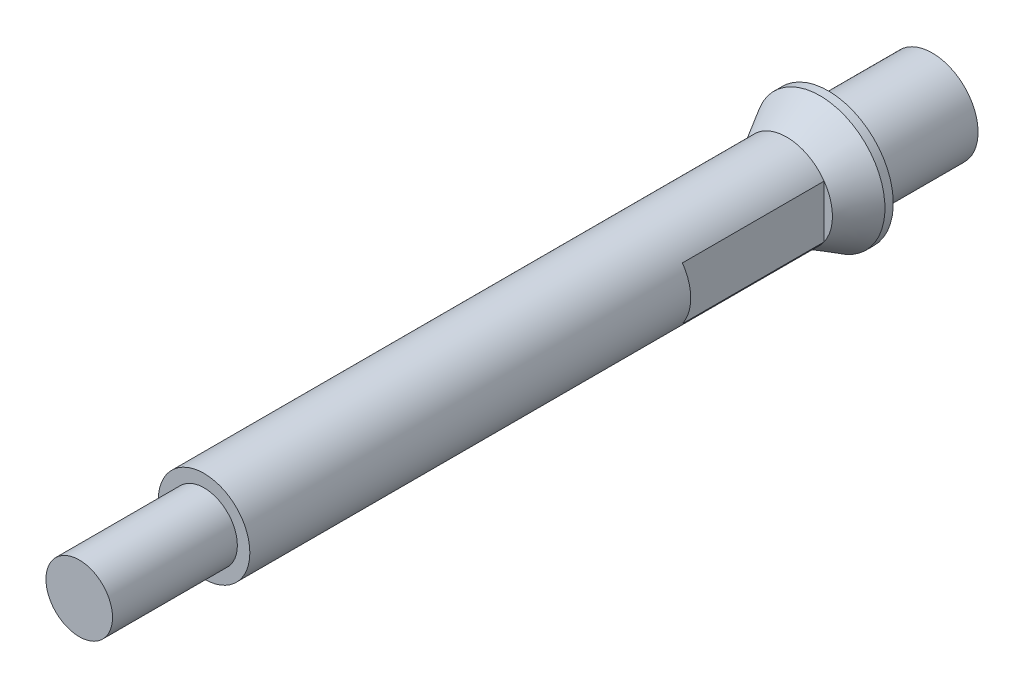
ISO-10303-21;
HEADER;
FILE_DESCRIPTION(('STEP AP214'),'2;1');
FILE_NAME('part.step','',(''),(''),'','','');
FILE_SCHEMA(('AUTOMOTIVE_DESIGN { 1 0 10303 214 1 1 1 1 }'));
ENDSEC;
DATA;
#1=APPLICATION_CONTEXT('core data for automotive mechanical design processes');
#2=APPLICATION_PROTOCOL_DEFINITION('international standard','automotive_design',2000,#1);
#3=PRODUCT_CONTEXT('',#1,'mechanical');
#4=PRODUCT('Part','Part','',(#3));
#5=PRODUCT_RELATED_PRODUCT_CATEGORY('part','',(#4));
#6=PRODUCT_DEFINITION_FORMATION('','',#4);
#7=PRODUCT_DEFINITION_CONTEXT('part definition',#1,'design');
#8=PRODUCT_DEFINITION('design','',#6,#7);
#9=PRODUCT_DEFINITION_SHAPE('','',#8);
#10=(LENGTH_UNIT() NAMED_UNIT(*) SI_UNIT(.MILLI.,.METRE.));
#11=(NAMED_UNIT(*) PLANE_ANGLE_UNIT() SI_UNIT($,.RADIAN.));
#12=(NAMED_UNIT(*) SI_UNIT($,.STERADIAN.) SOLID_ANGLE_UNIT());
#13=UNCERTAINTY_MEASURE_WITH_UNIT(LENGTH_MEASURE(1.E-05),#10,'distance_accuracy_value','');
#14=(GEOMETRIC_REPRESENTATION_CONTEXT(3) GLOBAL_UNCERTAINTY_ASSIGNED_CONTEXT((#13)) GLOBAL_UNIT_ASSIGNED_CONTEXT((#10,
#11,#12)) REPRESENTATION_CONTEXT('',''));
#15=CARTESIAN_POINT('',(0.,0.,0.));
#16=DIRECTION('',(0.,0.,1.));
#17=DIRECTION('',(1.,0.,0.));
#18=AXIS2_PLACEMENT_3D('',#15,#16,#17);
#19=CARTESIAN_POINT('',(0.,0.,-9.99999999999999));
#20=DIRECTION('',(0.,0.,-1.));
#21=DIRECTION('',(-1.,0.,0.));
#22=AXIS2_PLACEMENT_3D('',#19,#20,#21);
#23=PLANE('',#22);
#24=CARTESIAN_POINT('',(0.,0.,-9.99999999999999));
#25=DIRECTION('',(0.,0.,-1.));
#26=DIRECTION('',(-1.,0.,0.));
#27=AXIS2_PLACEMENT_3D('',#24,#25,#26);
#28=CIRCLE('',#27,15.618802153517);
#29=CARTESIAN_POINT('',(-15.618802153517,0.,-9.99999999999999));
#30=VERTEX_POINT('',#29);
#31=EDGE_CURVE('E103',#30,#30,#28,.T.);
#32=ORIENTED_EDGE('',*,*,#31,.T.);
#33=EDGE_LOOP('',(#32));
#34=FACE_BOUND('',#33,.T.);
#35=CARTESIAN_POINT('',(0.,0.,-9.99999999999999));
#36=DIRECTION('',(0.,0.,-1.));
#37=DIRECTION('',(-1.,0.,0.));
#38=AXIS2_PLACEMENT_3D('',#35,#36,#37);
#39=CIRCLE('',#38,11.);
#40=CARTESIAN_POINT('',(-11.,0.,-9.99999999999999));
#41=VERTEX_POINT('',#40);
#42=EDGE_CURVE('E130',#41,#41,#39,.T.);
#43=ORIENTED_EDGE('',*,*,#42,.F.);
#44=EDGE_LOOP('',(#43));
#45=FACE_BOUND('',#44,.T.);
#46=ADVANCED_FACE('F34',(#34,#45),#23,.T.);
#47=CARTESIAN_POINT('',(0.,0.,140.));
#48=DIRECTION('',(0.,0.,-1.));
#49=DIRECTION('',(-1.,0.,0.));
#50=AXIS2_PLACEMENT_3D('',#47,#48,#49);
#51=CYLINDRICAL_SURFACE('',#50,11.);
#52=CARTESIAN_POINT('',(0.,0.,140.));
#53=DIRECTION('',(0.,0.,1.));
#54=DIRECTION('',(1.,0.,0.));
#55=AXIS2_PLACEMENT_3D('',#52,#53,#54);
#56=CIRCLE('',#55,11.);
#57=CARTESIAN_POINT('',(11.,0.,140.));
#58=VERTEX_POINT('',#57);
#59=EDGE_CURVE('E111',#58,#58,#56,.T.);
#60=ORIENTED_EDGE('',*,*,#59,.F.);
#61=EDGE_LOOP('',(#60));
#62=FACE_BOUND('',#61,.T.);
#63=CARTESIAN_POINT('',(0.,0.,34.0532161369936));
#64=DIRECTION('',(0.,0.,-1.));
#65=DIRECTION('',(-1.,0.,0.));
#66=AXIS2_PLACEMENT_3D('',#63,#64,#65);
#67=CIRCLE('',#66,11.);
#68=CARTESIAN_POINT('',(8.99999999999991,6.32455532033666,34.0532161369936));
#69=VERTEX_POINT('',#68);
#70=CARTESIAN_POINT('',(8.99999999999995,-6.32455532033685,34.0532161369936));
#71=VERTEX_POINT('',#70);
#72=EDGE_CURVE('E11',#69,#71,#67,.T.);
#73=ORIENTED_EDGE('',*,*,#72,.F.);
#74=DIRECTION('',(0.,0.,-1.));
#75=VECTOR('',#74,1.);
#76=CARTESIAN_POINT('',(8.99999999999991,6.32455532033666,140.));
#77=LINE('',#76,#75);
#78=CARTESIAN_POINT('',(8.99999999999991,6.32455532033666,0.));
#79=VERTEX_POINT('',#78);
#80=EDGE_CURVE('E84',#79,#69,#77,.F.);
#81=ORIENTED_EDGE('',*,*,#80,.F.);
#82=CARTESIAN_POINT('',(0.,0.,0.));
#83=DIRECTION('',(0.,0.,-1.));
#84=DIRECTION('',(-1.,0.,0.));
#85=AXIS2_PLACEMENT_3D('',#82,#83,#84);
#86=CIRCLE('',#85,11.);
#87=CARTESIAN_POINT('',(-9.00000000000006,6.32455532033668,0.));
#88=VERTEX_POINT('',#87);
#89=EDGE_CURVE('E76',#88,#79,#86,.T.);
#90=ORIENTED_EDGE('',*,*,#89,.F.);
#91=DIRECTION('',(0.,0.,-1.));
#92=VECTOR('',#91,1.);
#93=CARTESIAN_POINT('',(-9.00000000000006,6.32455532033668,140.));
#94=LINE('',#93,#92);
#95=CARTESIAN_POINT('',(-9.00000000000006,6.32455532033668,34.0532161369936));
#96=VERTEX_POINT('',#95);
#97=EDGE_CURVE('E117',#96,#88,#94,.T.);
#98=ORIENTED_EDGE('',*,*,#97,.F.);
#99=CARTESIAN_POINT('',(0.,0.,34.0532161369936));
#100=DIRECTION('',(0.,0.,1.));
#101=DIRECTION('',(1.,0.,0.));
#102=AXIS2_PLACEMENT_3D('',#99,#100,#101);
#103=CIRCLE('',#102,11.);
#104=CARTESIAN_POINT('',(-9.00000000000005,-6.32455532033691,34.0532161369936));
#105=VERTEX_POINT('',#104);
#106=EDGE_CURVE('E42',#96,#105,#103,.T.);
#107=ORIENTED_EDGE('',*,*,#106,.T.);
#108=DIRECTION('',(0.,0.,-1.));
#109=VECTOR('',#108,1.);
#110=CARTESIAN_POINT('',(-9.00000000000005,-6.32455532033688,140.));
#111=LINE('',#110,#109);
#112=CARTESIAN_POINT('',(-9.00000000000005,-6.32455532033688,0.));
#113=VERTEX_POINT('',#112);
#114=EDGE_CURVE('E116',#113,#105,#111,.F.);
#115=ORIENTED_EDGE('',*,*,#114,.F.);
#116=CARTESIAN_POINT('',(8.99999999999995,-6.32455532033685,0.));
#117=VERTEX_POINT('',#116);
#118=EDGE_CURVE('E77',#117,#113,#86,.T.);
#119=ORIENTED_EDGE('',*,*,#118,.F.);
#120=DIRECTION('',(0.,0.,-1.));
#121=VECTOR('',#120,1.);
#122=CARTESIAN_POINT('',(8.99999999999995,-6.32455532033685,140.));
#123=LINE('',#122,#121);
#124=EDGE_CURVE('E87',#71,#117,#123,.T.);
#125=ORIENTED_EDGE('',*,*,#124,.F.);
#126=EDGE_LOOP('',(#73,#81,#90,#98,#107,#115,#119,#125));
#127=FACE_BOUND('',#126,.T.);
#128=ADVANCED_FACE('F36',(#62,#127),#51,.T.);
#129=CARTESIAN_POINT('',(0.,0.,140.));
#130=DIRECTION('',(0.,0.,1.));
#131=DIRECTION('',(1.,0.,0.));
#132=AXIS2_PLACEMENT_3D('',#129,#130,#131);
#133=PLANE('',#132);
#134=ORIENTED_EDGE('',*,*,#59,.T.);
#135=EDGE_LOOP('',(#134));
#136=FACE_BOUND('',#135,.T.);
#137=CARTESIAN_POINT('',(0.,0.,140.));
#138=DIRECTION('',(0.,0.,1.));
#139=DIRECTION('',(1.,0.,0.));
#140=AXIS2_PLACEMENT_3D('',#137,#138,#139);
#141=CIRCLE('',#140,8.);
#142=CARTESIAN_POINT('',(8.00000000000001,0.,140.));
#143=VERTEX_POINT('',#142);
#144=EDGE_CURVE('E107',#143,#143,#141,.T.);
#145=ORIENTED_EDGE('',*,*,#144,.F.);
#146=EDGE_LOOP('',(#145));
#147=FACE_BOUND('',#146,.T.);
#148=ADVANCED_FACE('F150',(#136,#147),#133,.T.);
#149=CARTESIAN_POINT('',(0.,0.,170.));
#150=DIRECTION('',(0.,0.,-1.));
#151=DIRECTION('',(-1.,0.,0.));
#152=AXIS2_PLACEMENT_3D('',#149,#150,#151);
#153=CYLINDRICAL_SURFACE('',#152,8.);
#154=CARTESIAN_POINT('',(0.,0.,170.));
#155=DIRECTION('',(0.,0.,1.));
#156=DIRECTION('',(1.,0.,0.));
#157=AXIS2_PLACEMENT_3D('',#154,#155,#156);
#158=CIRCLE('',#157,8.);
#159=CARTESIAN_POINT('',(8.00000000000001,0.,170.));
#160=VERTEX_POINT('',#159);
#161=EDGE_CURVE('E108',#160,#160,#158,.T.);
#162=ORIENTED_EDGE('',*,*,#161,.F.);
#163=EDGE_LOOP('',(#162));
#164=FACE_BOUND('',#163,.T.);
#165=ORIENTED_EDGE('',*,*,#144,.T.);
#166=EDGE_LOOP('',(#165));
#167=FACE_BOUND('',#166,.T.);
#168=ADVANCED_FACE('F167',(#164,#167),#153,.T.);
#169=CARTESIAN_POINT('',(0.,0.,170.));
#170=DIRECTION('',(0.,0.,1.));
#171=DIRECTION('',(1.,0.,0.));
#172=AXIS2_PLACEMENT_3D('',#169,#170,#171);
#173=PLANE('',#172);
#174=ORIENTED_EDGE('',*,*,#161,.T.);
#175=EDGE_LOOP('',(#174));
#176=FACE_BOUND('',#175,.T.);
#177=ADVANCED_FACE('F163',(#176),#173,.T.);
#178=CARTESIAN_POINT('',(0.,0.,0.));
#179=DIRECTION('',(0.,0.,-1.));
#180=DIRECTION('',(-1.,0.,0.));
#181=AXIS2_PLACEMENT_3D('',#178,#179,#180);
#182=CONICAL_SURFACE('',#181,11.,0.5235987755983);
#183=CARTESIAN_POINT('',(0.,0.,-8.));
#184=DIRECTION('',(0.,0.,-1.));
#185=DIRECTION('',(-1.,0.,0.));
#186=AXIS2_PLACEMENT_3D('',#183,#184,#185);
#187=CIRCLE('',#186,15.618802153517);
#188=CARTESIAN_POINT('',(-15.618802153517,0.,-8.));
#189=VERTEX_POINT('',#188);
#190=EDGE_CURVE('E100',#189,#189,#187,.T.);
#191=ORIENTED_EDGE('',*,*,#190,.F.);
#192=EDGE_LOOP('',(#191));
#193=FACE_BOUND('',#192,.T.);
#194=EDGE_CURVE('E99',#113,#88,#86,.T.);
#195=ORIENTED_EDGE('',*,*,#194,.T.);
#196=ORIENTED_EDGE('',*,*,#89,.T.);
#197=EDGE_CURVE('E49',#79,#117,#86,.T.);
#198=ORIENTED_EDGE('',*,*,#197,.T.);
#199=ORIENTED_EDGE('',*,*,#118,.T.);
#200=EDGE_LOOP('',(#195,#196,#198,#199));
#201=FACE_BOUND('',#200,.T.);
#202=ADVANCED_FACE('F97',(#193,#201),#182,.T.);
#203=CARTESIAN_POINT('',(0.,0.,-9.99999999999999));
#204=DIRECTION('',(0.,0.,1.));
#205=DIRECTION('',(1.,0.,0.));
#206=AXIS2_PLACEMENT_3D('',#203,#204,#205);
#207=CYLINDRICAL_SURFACE('',#206,15.618802153517);
#208=ORIENTED_EDGE('',*,*,#31,.F.);
#209=EDGE_LOOP('',(#208));
#210=FACE_BOUND('',#209,.T.);
#211=ORIENTED_EDGE('',*,*,#190,.T.);
#212=EDGE_LOOP('',(#211));
#213=FACE_BOUND('',#212,.T.);
#214=ADVANCED_FACE('F156',(#210,#213),#207,.T.);
#215=CARTESIAN_POINT('',(-9.00000000000006,7.49999999999987,34.0532161369936));
#216=DIRECTION('',(0.,0.,1.));
#217=DIRECTION('',(1.,0.,0.));
#218=AXIS2_PLACEMENT_3D('',#215,#216,#217);
#219=PLANE('',#218);
#220=DIRECTION('',(0.,1.,0.));
#221=VECTOR('',#220,1.);
#222=CARTESIAN_POINT('',(-9.00000000000006,7.49999999999987,34.0532161369936));
#223=LINE('',#222,#221);
#224=EDGE_CURVE('E122',#105,#96,#223,.T.);
#225=ORIENTED_EDGE('',*,*,#224,.F.);
#226=ORIENTED_EDGE('',*,*,#106,.F.);
#227=EDGE_LOOP('',(#225,#226));
#228=FACE_BOUND('',#227,.T.);
#229=ADVANCED_FACE('F159',(#228),#219,.F.);
#230=CARTESIAN_POINT('',(-9.00000000000006,7.49999999999987,0.));
#231=DIRECTION('',(0.,0.,-1.));
#232=DIRECTION('',(-1.,0.,0.));
#233=AXIS2_PLACEMENT_3D('',#230,#231,#232);
#234=PLANE('',#233);
#235=ORIENTED_EDGE('',*,*,#194,.F.);
#236=DIRECTION('',(0.,-1.,0.));
#237=VECTOR('',#236,1.);
#238=CARTESIAN_POINT('',(-9.00000000000006,7.49999999999987,0.));
#239=LINE('',#238,#237);
#240=EDGE_CURVE('E126',#88,#113,#239,.T.);
#241=ORIENTED_EDGE('',*,*,#240,.F.);
#242=EDGE_LOOP('',(#235,#241));
#243=FACE_BOUND('',#242,.T.);
#244=ADVANCED_FACE('F154',(#243),#234,.F.);
#245=CARTESIAN_POINT('',(-9.00000000000005,-7.50000000000006,0.));
#246=DIRECTION('',(-1.,0.,0.));
#247=DIRECTION('',(0.,0.,1.));
#248=AXIS2_PLACEMENT_3D('',#245,#246,#247);
#249=PLANE('',#248);
#250=ORIENTED_EDGE('',*,*,#97,.T.);
#251=ORIENTED_EDGE('',*,*,#240,.T.);
#252=ORIENTED_EDGE('',*,*,#114,.T.);
#253=ORIENTED_EDGE('',*,*,#224,.T.);
#254=EDGE_LOOP('',(#250,#251,#252,#253));
#255=FACE_BOUND('',#254,.T.);
#256=ADVANCED_FACE('F208',(#255),#249,.T.);
#257=CARTESIAN_POINT('',(9.00000000000001,7.50000000000001,34.0532161369936));
#258=DIRECTION('',(0.,0.,-1.));
#259=DIRECTION('',(-1.,0.,0.));
#260=AXIS2_PLACEMENT_3D('',#257,#258,#259);
#261=PLANE('',#260);
#262=DIRECTION('',(0.,1.,0.));
#263=VECTOR('',#262,1.);
#264=CARTESIAN_POINT('',(9.00000000000001,7.50000000000001,34.0532161369936));
#265=LINE('',#264,#263);
#266=EDGE_CURVE('E89',#71,#69,#265,.T.);
#267=ORIENTED_EDGE('',*,*,#266,.T.);
#268=ORIENTED_EDGE('',*,*,#72,.T.);
#269=EDGE_LOOP('',(#267,#268));
#270=FACE_BOUND('',#269,.T.);
#271=ADVANCED_FACE('F215',(#270),#261,.T.);
#272=CARTESIAN_POINT('',(9.00000000000001,7.50000000000001,0.));
#273=DIRECTION('',(0.,0.,1.));
#274=DIRECTION('',(1.,0.,0.));
#275=AXIS2_PLACEMENT_3D('',#272,#273,#274);
#276=PLANE('',#275);
#277=ORIENTED_EDGE('',*,*,#197,.F.);
#278=DIRECTION('',(0.,-1.,0.));
#279=VECTOR('',#278,1.);
#280=CARTESIAN_POINT('',(9.00000000000001,7.50000000000001,0.));
#281=LINE('',#280,#279);
#282=EDGE_CURVE('E74',#79,#117,#281,.T.);
#283=ORIENTED_EDGE('',*,*,#282,.T.);
#284=EDGE_LOOP('',(#277,#283));
#285=FACE_BOUND('',#284,.T.);
#286=ADVANCED_FACE('F73',(#285),#276,.T.);
#287=CARTESIAN_POINT('',(8.99999999999997,-7.50000000000009,0.));
#288=DIRECTION('',(1.,0.,0.));
#289=DIRECTION('',(0.,0.,1.));
#290=AXIS2_PLACEMENT_3D('',#287,#288,#289);
#291=PLANE('',#290);
#292=ORIENTED_EDGE('',*,*,#124,.T.);
#293=ORIENTED_EDGE('',*,*,#282,.F.);
#294=ORIENTED_EDGE('',*,*,#80,.T.);
#295=ORIENTED_EDGE('',*,*,#266,.F.);
#296=EDGE_LOOP('',(#292,#293,#294,#295));
#297=FACE_BOUND('',#296,.T.);
#298=ADVANCED_FACE('F82',(#297),#291,.T.);
#299=CARTESIAN_POINT('',(0.,0.,-35.));
#300=DIRECTION('',(0.,0.,1.));
#301=DIRECTION('',(1.,0.,0.));
#302=AXIS2_PLACEMENT_3D('',#299,#300,#301);
#303=CYLINDRICAL_SURFACE('',#302,11.);
#304=CARTESIAN_POINT('',(0.,0.,-35.));
#305=DIRECTION('',(0.,0.,-1.));
#306=DIRECTION('',(-1.,0.,0.));
#307=AXIS2_PLACEMENT_3D('',#304,#305,#306);
#308=CIRCLE('',#307,11.);
#309=CARTESIAN_POINT('',(-11.,0.,-35.));
#310=VERTEX_POINT('',#309);
#311=EDGE_CURVE('E90',#310,#310,#308,.T.);
#312=ORIENTED_EDGE('',*,*,#311,.F.);
#313=EDGE_LOOP('',(#312));
#314=FACE_BOUND('',#313,.T.);
#315=ORIENTED_EDGE('',*,*,#42,.T.);
#316=EDGE_LOOP('',(#315));
#317=FACE_BOUND('',#316,.T.);
#318=ADVANCED_FACE('F138',(#314,#317),#303,.T.);
#319=CARTESIAN_POINT('',(0.,0.,-35.));
#320=DIRECTION('',(0.,0.,-1.));
#321=DIRECTION('',(-1.,0.,0.));
#322=AXIS2_PLACEMENT_3D('',#319,#320,#321);
#323=PLANE('',#322);
#324=ORIENTED_EDGE('',*,*,#311,.T.);
#325=EDGE_LOOP('',(#324));
#326=FACE_BOUND('',#325,.T.);
#327=ADVANCED_FACE('F136',(#326),#323,.T.);
#328=CLOSED_SHELL('',(#46,#128,#148,#168,#177,#202,#214,#229,#244,#256,#271,#286,#298,#318,#327));
#329=MANIFOLD_SOLID_BREP('B2',#328);
#330=ADVANCED_BREP_SHAPE_REPRESENTATION('',(#18,#329),#14);
#331=SHAPE_DEFINITION_REPRESENTATION(#9,#330);
ENDSEC;
END-ISO-10303-21;
